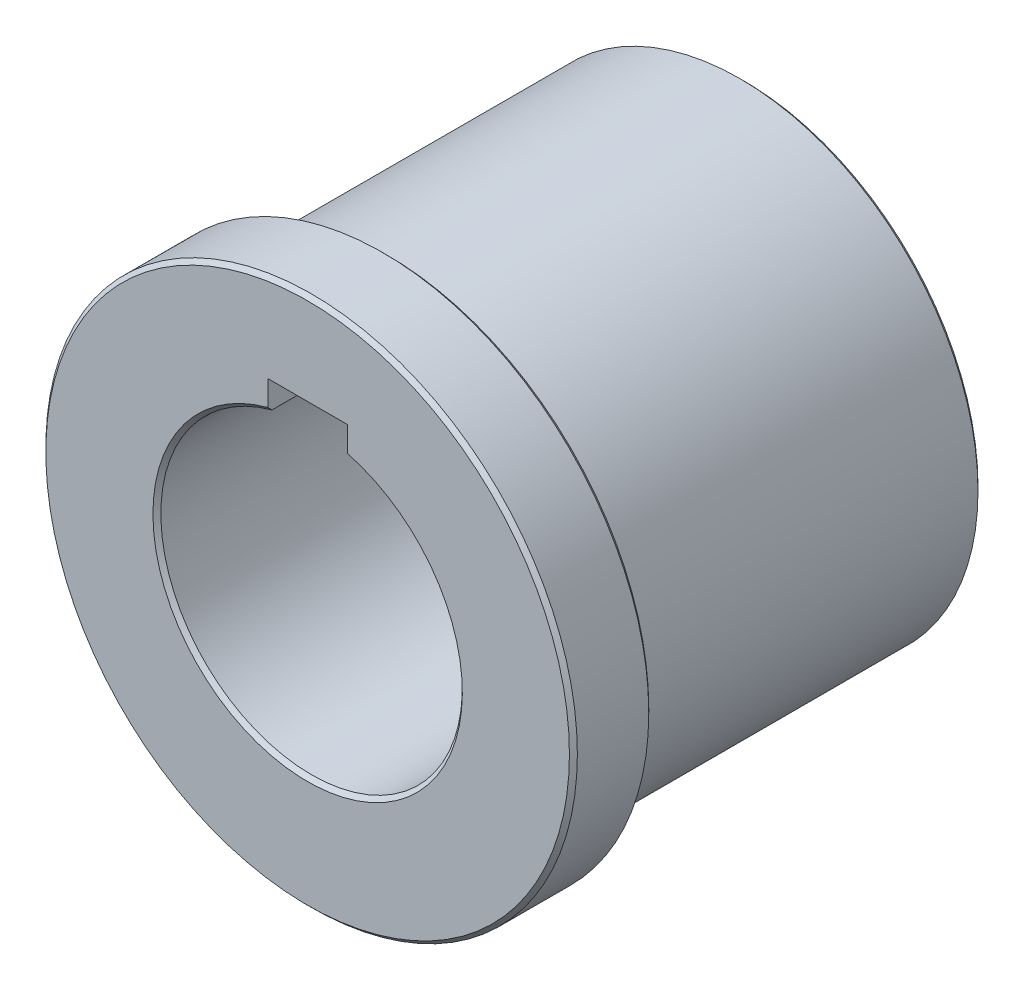
ISO-10303-21;
HEADER;
FILE_DESCRIPTION(('STEP AP214'),'2;1');
FILE_NAME('part.step','',(''),(''),'','','');
FILE_SCHEMA(('AUTOMOTIVE_DESIGN { 1 0 10303 214 1 1 1 1 }'));
ENDSEC;
DATA;
#1=APPLICATION_CONTEXT('core data for automotive mechanical design processes');
#2=APPLICATION_PROTOCOL_DEFINITION('international standard','automotive_design',2000,#1);
#3=PRODUCT_CONTEXT('',#1,'mechanical');
#4=PRODUCT('Part','Part','',(#3));
#5=PRODUCT_RELATED_PRODUCT_CATEGORY('part','',(#4));
#6=PRODUCT_DEFINITION_FORMATION('','',#4);
#7=PRODUCT_DEFINITION_CONTEXT('part definition',#1,'design');
#8=PRODUCT_DEFINITION('design','',#6,#7);
#9=PRODUCT_DEFINITION_SHAPE('','',#8);
#10=(LENGTH_UNIT() NAMED_UNIT(*) SI_UNIT(.MILLI.,.METRE.));
#11=(NAMED_UNIT(*) PLANE_ANGLE_UNIT() SI_UNIT($,.RADIAN.));
#12=(NAMED_UNIT(*) SI_UNIT($,.STERADIAN.) SOLID_ANGLE_UNIT());
#13=UNCERTAINTY_MEASURE_WITH_UNIT(LENGTH_MEASURE(1.E-05),#10,'distance_accuracy_value','');
#14=(GEOMETRIC_REPRESENTATION_CONTEXT(3) GLOBAL_UNCERTAINTY_ASSIGNED_CONTEXT((#13)) GLOBAL_UNIT_ASSIGNED_CONTEXT((#10,
#11,#12)) REPRESENTATION_CONTEXT('',''));
#15=CARTESIAN_POINT('',(0.,0.,0.));
#16=DIRECTION('',(0.,0.,1.));
#17=DIRECTION('',(1.,0.,0.));
#18=AXIS2_PLACEMENT_3D('',#15,#16,#17);
#19=CARTESIAN_POINT('',(0.,0.,45.));
#20=DIRECTION('',(0.,0.,-1.));
#21=DIRECTION('',(-1.,0.,0.));
#22=AXIS2_PLACEMENT_3D('',#19,#20,#21);
#23=CYLINDRICAL_SURFACE('',#22,30.);
#24=CARTESIAN_POINT('',(0.,0.,0.500000000000056));
#25=DIRECTION('',(0.,0.,1.));
#26=DIRECTION('',(1.,0.,0.));
#27=AXIS2_PLACEMENT_3D('',#24,#25,#26);
#28=CIRCLE('',#27,30.);
#29=CARTESIAN_POINT('',(-30.,0.,0.500000000000049));
#30=VERTEX_POINT('',#29);
#31=EDGE_CURVE('E498',#30,#30,#28,.T.);
#32=CARTESIAN_POINT('',(0.,0.,45.));
#33=DIRECTION('',(0.,0.,1.));
#34=DIRECTION('',(1.,0.,0.));
#35=AXIS2_PLACEMENT_3D('',#32,#33,#34);
#36=CIRCLE('',#35,30.);
#37=CARTESIAN_POINT('',(-30.,0.,45.));
#38=VERTEX_POINT('',#37);
#39=EDGE_CURVE('E127',#38,#38,#36,.T.);
#40=CARTESIAN_POINT('',(-30.,0.,0.500000000000049));
#41=CARTESIAN_POINT('',(-30.,0.,0.963541666666716));
#42=CARTESIAN_POINT('',(-30.,0.,1.42708333333338));
#43=CARTESIAN_POINT('',(-30.,0.,2.35416666666671));
#44=CARTESIAN_POINT('',(-30.,0.,2.81770833333338));
#45=CARTESIAN_POINT('',(-30.,0.,3.74479166666671));
#46=CARTESIAN_POINT('',(-30.,0.,4.20833333333338));
#47=CARTESIAN_POINT('',(-30.,0.,5.13541666666671));
#48=CARTESIAN_POINT('',(-30.,0.,5.59895833333337));
#49=CARTESIAN_POINT('',(-30.,0.,6.52604166666671));
#50=CARTESIAN_POINT('',(-30.,0.,6.98958333333337));
#51=CARTESIAN_POINT('',(-30.,0.,7.91666666666671));
#52=CARTESIAN_POINT('',(-30.,0.,8.38020833333337));
#53=CARTESIAN_POINT('',(-30.,0.,9.30729166666671));
#54=CARTESIAN_POINT('',(-30.,0.,9.77083333333337));
#55=CARTESIAN_POINT('',(-30.,0.,10.6979166666667));
#56=CARTESIAN_POINT('',(-30.,0.,11.1614583333334));
#57=CARTESIAN_POINT('',(-30.,0.,12.0885416666667));
#58=CARTESIAN_POINT('',(-30.,0.,12.5520833333334));
#59=CARTESIAN_POINT('',(-30.,0.,13.4791666666667));
#60=CARTESIAN_POINT('',(-30.,0.,13.9427083333334));
#61=CARTESIAN_POINT('',(-30.,0.,14.8697916666667));
#62=CARTESIAN_POINT('',(-30.,0.,15.3333333333334));
#63=CARTESIAN_POINT('',(-30.,0.,16.2604166666667));
#64=CARTESIAN_POINT('',(-30.,0.,16.7239583333334));
#65=CARTESIAN_POINT('',(-30.,0.,17.6510416666667));
#66=CARTESIAN_POINT('',(-30.,0.,18.1145833333334));
#67=CARTESIAN_POINT('',(-30.,0.,19.0416666666667));
#68=CARTESIAN_POINT('',(-30.,0.,19.5052083333334));
#69=CARTESIAN_POINT('',(-30.,0.,20.4322916666667));
#70=CARTESIAN_POINT('',(-30.,0.,20.8958333333334));
#71=CARTESIAN_POINT('',(-30.,0.,21.8229166666667));
#72=CARTESIAN_POINT('',(-30.,0.,22.2864583333334));
#73=CARTESIAN_POINT('',(-30.,0.,23.2135416666667));
#74=CARTESIAN_POINT('',(-30.,0.,23.6770833333334));
#75=CARTESIAN_POINT('',(-30.,0.,24.6041666666667));
#76=CARTESIAN_POINT('',(-30.,0.,25.0677083333333));
#77=CARTESIAN_POINT('',(-30.,0.,25.9947916666667));
#78=CARTESIAN_POINT('',(-30.,0.,26.4583333333333));
#79=CARTESIAN_POINT('',(-30.,0.,27.3854166666667));
#80=CARTESIAN_POINT('',(-30.,0.,27.8489583333333));
#81=CARTESIAN_POINT('',(-30.,0.,28.7760416666667));
#82=CARTESIAN_POINT('',(-30.,0.,29.2395833333333));
#83=CARTESIAN_POINT('',(-30.,0.,30.1666666666667));
#84=CARTESIAN_POINT('',(-30.,0.,30.6302083333333));
#85=CARTESIAN_POINT('',(-30.,0.,31.5572916666667));
#86=CARTESIAN_POINT('',(-30.,0.,32.0208333333333));
#87=CARTESIAN_POINT('',(-30.,0.,32.9479166666667));
#88=CARTESIAN_POINT('',(-30.,0.,33.4114583333333));
#89=CARTESIAN_POINT('',(-30.,0.,34.3385416666667));
#90=CARTESIAN_POINT('',(-30.,0.,34.8020833333333));
#91=CARTESIAN_POINT('',(-30.,0.,35.7291666666667));
#92=CARTESIAN_POINT('',(-30.,0.,36.1927083333333));
#93=CARTESIAN_POINT('',(-30.,0.,37.1197916666667));
#94=CARTESIAN_POINT('',(-30.,0.,37.5833333333333));
#95=CARTESIAN_POINT('',(-30.,0.,38.5104166666667));
#96=CARTESIAN_POINT('',(-30.,0.,38.9739583333333));
#97=CARTESIAN_POINT('',(-30.,0.,39.9010416666667));
#98=CARTESIAN_POINT('',(-30.,0.,40.3645833333333));
#99=CARTESIAN_POINT('',(-30.,0.,41.2916666666667));
#100=CARTESIAN_POINT('',(-30.,0.,41.7552083333333));
#101=CARTESIAN_POINT('',(-30.,0.,42.6822916666667));
#102=CARTESIAN_POINT('',(-30.,0.,43.1458333333333));
#103=CARTESIAN_POINT('',(-30.,0.,44.0729166666667));
#104=CARTESIAN_POINT('',(-30.,0.,44.5364583333333));
#105=CARTESIAN_POINT('',(-30.,0.,45.));
#106=B_SPLINE_CURVE_WITH_KNOTS('',3,(#40,#41,#42,#43,#44,#45,#46,#47,#48,#49,#50,#51,#52,#53,
#54,#55,#56,#57,#58,#59,#60,#61,#62,#63,#64,#65,#66,#67,#68,#69,#70,#71,#72,#73,#74,#75,#76,#77,
#78,#79,#80,#81,#82,#83,#84,#85,#86,#87,#88,#89,#90,#91,#92,#93,#94,#95,#96,#97,#98,#99,#100,
#101,#102,#103,#104,#105),.UNSPECIFIED.,.F.,.F.,(4,2,2,2,2,2,2,2,2,2,2,2,2,2,2,2,2,2,2,2,2,2,2,
2,2,2,2,2,2,2,2,2,4),(0.,1.390625,2.78125,4.17187499999999,5.56249999999999,6.95312499999999,
8.34374999999999,9.73437499999999,11.125,12.515625,13.90625,15.296875,16.6875,18.078125,
19.46875,20.859375,22.25,23.640625,25.03125,26.421875,27.8125,29.203125,30.59375,31.984375,
33.375,34.765625,36.15625,37.546875,38.9375,40.3281249999999,41.7187499999999,43.1093749999999,
44.4999999999999),.UNSPECIFIED.);
#107=EDGE_CURVE('BSEAM37',#30,#38,#106,.T.);
#108=ORIENTED_EDGE('',*,*,#31,.T.);
#109=ORIENTED_EDGE('',*,*,#39,.F.);
#110=ORIENTED_EDGE('',*,*,#107,.T.);
#111=ORIENTED_EDGE('',*,*,#107,.F.);
#112=EDGE_LOOP('',(#108,#110,#109,#111));
#113=FACE_BOUND('',#112,.T.);
#114=ADVANCED_FACE('F37',(#113),#23,.T.);
#115=CARTESIAN_POINT('',(0.,0.,0.));
#116=DIRECTION('',(0.,0.,1.));
#117=DIRECTION('',(1.,0.,0.));
#118=AXIS2_PLACEMENT_3D('',#115,#116,#117);
#119=PLANE('',#118);
#120=CARTESIAN_POINT('',(0.,0.,0.));
#121=DIRECTION('',(0.,0.,1.));
#122=DIRECTION('',(1.,0.,0.));
#123=AXIS2_PLACEMENT_3D('',#120,#121,#122);
#124=CIRCLE('',#123,29.4999999999999);
#125=CARTESIAN_POINT('',(29.4999999999999,0.,0.));
#126=VERTEX_POINT('',#125);
#127=EDGE_CURVE('E205',#126,#126,#124,.F.);
#128=ORIENTED_EDGE('',*,*,#127,.T.);
#129=EDGE_LOOP('',(#128));
#130=FACE_BOUND('',#129,.T.);
#131=CARTESIAN_POINT('',(-25.,0.,0.));
#132=DIRECTION('',(0.,0.,1.));
#133=DIRECTION('',(1.,0.,0.));
#134=AXIS2_PLACEMENT_3D('',#131,#132,#133);
#135=CIRCLE('',#134,2.99999999999999);
#136=CARTESIAN_POINT('',(-22.,0.,0.));
#137=VERTEX_POINT('',#136);
#138=EDGE_CURVE('E294',#137,#137,#135,.T.);
#139=ORIENTED_EDGE('',*,*,#138,.T.);
#140=EDGE_LOOP('',(#139));
#141=FACE_BOUND('',#140,.T.);
#142=CARTESIAN_POINT('',(-12.5,-21.650635094611,0.));
#143=DIRECTION('',(0.,0.,1.));
#144=DIRECTION('',(1.,0.,0.));
#145=AXIS2_PLACEMENT_3D('',#142,#143,#144);
#146=CIRCLE('',#145,3.);
#147=CARTESIAN_POINT('',(-9.49999999999996,-21.650635094611,0.));
#148=VERTEX_POINT('',#147);
#149=EDGE_CURVE('E288',#148,#148,#146,.T.);
#150=ORIENTED_EDGE('',*,*,#149,.T.);
#151=EDGE_LOOP('',(#150));
#152=FACE_BOUND('',#151,.T.);
#153=CARTESIAN_POINT('',(12.5,-21.6506350946109,0.));
#154=DIRECTION('',(0.,0.,1.));
#155=DIRECTION('',(1.,0.,0.));
#156=AXIS2_PLACEMENT_3D('',#153,#154,#155);
#157=CIRCLE('',#156,3.);
#158=CARTESIAN_POINT('',(15.5,-21.6506350946109,0.));
#159=VERTEX_POINT('',#158);
#160=EDGE_CURVE('E282',#159,#159,#157,.T.);
#161=ORIENTED_EDGE('',*,*,#160,.T.);
#162=EDGE_LOOP('',(#161));
#163=FACE_BOUND('',#162,.T.);
#164=CARTESIAN_POINT('',(25.,0.,0.));
#165=DIRECTION('',(0.,0.,1.));
#166=DIRECTION('',(1.,0.,0.));
#167=AXIS2_PLACEMENT_3D('',#164,#165,#166);
#168=CIRCLE('',#167,2.99999999999999);
#169=CARTESIAN_POINT('',(28.,0.,0.));
#170=VERTEX_POINT('',#169);
#171=EDGE_CURVE('E276',#170,#170,#168,.T.);
#172=ORIENTED_EDGE('',*,*,#171,.T.);
#173=EDGE_LOOP('',(#172));
#174=FACE_BOUND('',#173,.T.);
#175=CARTESIAN_POINT('',(12.5,21.650635094611,0.));
#176=DIRECTION('',(0.,0.,1.));
#177=DIRECTION('',(1.,0.,0.));
#178=AXIS2_PLACEMENT_3D('',#175,#176,#177);
#179=CIRCLE('',#178,3.);
#180=CARTESIAN_POINT('',(15.5,21.650635094611,0.));
#181=VERTEX_POINT('',#180);
#182=EDGE_CURVE('E267',#181,#181,#179,.T.);
#183=ORIENTED_EDGE('',*,*,#182,.T.);
#184=EDGE_LOOP('',(#183));
#185=FACE_BOUND('',#184,.T.);
#186=CARTESIAN_POINT('',(-12.5,21.6506350946109,0.));
#187=DIRECTION('',(0.,0.,1.));
#188=DIRECTION('',(1.,0.,0.));
#189=AXIS2_PLACEMENT_3D('',#186,#187,#188);
#190=CIRCLE('',#189,3.);
#191=CARTESIAN_POINT('',(-9.50000000000003,21.6506350946109,0.));
#192=VERTEX_POINT('',#191);
#193=EDGE_CURVE('E266',#192,#192,#190,.T.);
#194=ORIENTED_EDGE('',*,*,#193,.T.);
#195=EDGE_LOOP('',(#194));
#196=FACE_BOUND('',#195,.T.);
#197=DIRECTION('',(0.,-1.,0.));
#198=VECTOR('',#197,1.);
#199=CARTESIAN_POINT('',(-5.,18.3303027798234,0.));
#200=LINE('',#199,#198);
#201=CARTESIAN_POINT('',(-5.,22.,0.));
#202=VERTEX_POINT('',#201);
#203=CARTESIAN_POINT('',(-5.,18.8480768249708,0.));
#204=VERTEX_POINT('',#203);
#205=EDGE_CURVE('E106',#202,#204,#200,.T.);
#206=ORIENTED_EDGE('',*,*,#205,.T.);
#207=CARTESIAN_POINT('',(0.,0.,0.));
#208=DIRECTION('',(0.,0.,1.));
#209=DIRECTION('',(1.,0.,0.));
#210=AXIS2_PLACEMENT_3D('',#207,#208,#209);
#211=CIRCLE('',#210,19.5);
#212=CARTESIAN_POINT('',(5.,18.8480768249708,0.));
#213=VERTEX_POINT('',#212);
#214=EDGE_CURVE('E497',#204,#213,#211,.T.);
#215=ORIENTED_EDGE('',*,*,#214,.T.);
#216=DIRECTION('',(0.,1.,0.));
#217=VECTOR('',#216,1.);
#218=CARTESIAN_POINT('',(5.,18.3303027798234,0.));
#219=LINE('',#218,#217);
#220=CARTESIAN_POINT('',(5.,22.,0.));
#221=VERTEX_POINT('',#220);
#222=EDGE_CURVE('E115',#213,#221,#219,.T.);
#223=ORIENTED_EDGE('',*,*,#222,.T.);
#224=DIRECTION('',(-1.,0.,0.));
#225=VECTOR('',#224,1.);
#226=CARTESIAN_POINT('',(-5.,22.,0.));
#227=LINE('',#226,#225);
#228=EDGE_CURVE('E99',#221,#202,#227,.T.);
#229=ORIENTED_EDGE('',*,*,#228,.T.);
#230=EDGE_LOOP('',(#206,#215,#223,#229));
#231=FACE_BOUND('',#230,.T.);
#232=ADVANCED_FACE('F113',(#130,#141,#152,#163,#174,#185,#196,#231),#119,.F.);
#233=CARTESIAN_POINT('',(0.,0.,55.));
#234=DIRECTION('',(0.,0.,-1.));
#235=DIRECTION('',(-1.,0.,0.));
#236=AXIS2_PLACEMENT_3D('',#233,#234,#235);
#237=CYLINDRICAL_SURFACE('',#236,33.5);
#238=CARTESIAN_POINT('',(0.,0.,45.5));
#239=DIRECTION('',(0.,0.,1.));
#240=DIRECTION('',(1.,0.,0.));
#241=AXIS2_PLACEMENT_3D('',#238,#239,#240);
#242=CIRCLE('',#241,33.5);
#243=CARTESIAN_POINT('',(33.5,0.,45.5));
#244=VERTEX_POINT('',#243);
#245=EDGE_CURVE('E46',#244,#244,#242,.T.);
#246=ORIENTED_EDGE('',*,*,#245,.T.);
#247=EDGE_LOOP('',(#246));
#248=FACE_BOUND('',#247,.T.);
#249=CARTESIAN_POINT('',(0.,0.,54.5));
#250=DIRECTION('',(0.,0.,1.));
#251=DIRECTION('',(1.,0.,0.));
#252=AXIS2_PLACEMENT_3D('',#249,#250,#251);
#253=CIRCLE('',#252,33.5);
#254=CARTESIAN_POINT('',(33.5,0.,54.5));
#255=VERTEX_POINT('',#254);
#256=EDGE_CURVE('E489',#255,#255,#253,.F.);
#257=ORIENTED_EDGE('',*,*,#256,.T.);
#258=EDGE_LOOP('',(#257));
#259=FACE_BOUND('',#258,.T.);
#260=ADVANCED_FACE('F175',(#248,#259),#237,.T.);
#261=CARTESIAN_POINT('',(0.,0.,55.));
#262=DIRECTION('',(0.,0.,1.));
#263=DIRECTION('',(1.,0.,0.));
#264=AXIS2_PLACEMENT_3D('',#261,#262,#263);
#265=PLANE('',#264);
#266=CARTESIAN_POINT('',(0.,0.,55.));
#267=DIRECTION('',(0.,0.,1.));
#268=DIRECTION('',(1.,0.,0.));
#269=AXIS2_PLACEMENT_3D('',#266,#267,#268);
#270=CIRCLE('',#269,33.);
#271=CARTESIAN_POINT('',(33.,0.,55.));
#272=VERTEX_POINT('',#271);
#273=EDGE_CURVE('E492',#272,#272,#270,.T.);
#274=ORIENTED_EDGE('',*,*,#273,.T.);
#275=EDGE_LOOP('',(#274));
#276=FACE_BOUND('',#275,.T.);
#277=DIRECTION('',(0.,1.,0.));
#278=VECTOR('',#277,1.);
#279=CARTESIAN_POINT('',(5.,18.3303027798234,55.));
#280=LINE('',#279,#278);
#281=CARTESIAN_POINT('',(5.,18.8480768249708,55.));
#282=VERTEX_POINT('',#281);
#283=CARTESIAN_POINT('',(5.,22.,55.));
#284=VERTEX_POINT('',#283);
#285=EDGE_CURVE('E121',#282,#284,#280,.T.);
#286=ORIENTED_EDGE('',*,*,#285,.F.);
#287=CARTESIAN_POINT('',(0.,0.,55.));
#288=DIRECTION('',(0.,0.,1.));
#289=DIRECTION('',(1.,0.,0.));
#290=AXIS2_PLACEMENT_3D('',#287,#288,#289);
#291=CIRCLE('',#290,19.5);
#292=CARTESIAN_POINT('',(-5.,18.8480768249708,55.));
#293=VERTEX_POINT('',#292);
#294=EDGE_CURVE('E61',#282,#293,#291,.F.);
#295=ORIENTED_EDGE('',*,*,#294,.T.);
#296=DIRECTION('',(0.,-1.,0.));
#297=VECTOR('',#296,1.);
#298=CARTESIAN_POINT('',(-5.,18.3303027798234,55.));
#299=LINE('',#298,#297);
#300=CARTESIAN_POINT('',(-5.,22.,55.));
#301=VERTEX_POINT('',#300);
#302=EDGE_CURVE('E117',#301,#293,#299,.T.);
#303=ORIENTED_EDGE('',*,*,#302,.F.);
#304=DIRECTION('',(-1.,0.,0.));
#305=VECTOR('',#304,1.);
#306=CARTESIAN_POINT('',(-5.,22.,55.));
#307=LINE('',#306,#305);
#308=EDGE_CURVE('E102',#284,#301,#307,.T.);
#309=ORIENTED_EDGE('',*,*,#308,.F.);
#310=EDGE_LOOP('',(#286,#295,#303,#309));
#311=FACE_BOUND('',#310,.T.);
#312=ADVANCED_FACE('F172',(#276,#311),#265,.T.);
#313=CARTESIAN_POINT('',(0.,0.,45.));
#314=DIRECTION('',(0.,0.,1.));
#315=DIRECTION('',(1.,0.,0.));
#316=AXIS2_PLACEMENT_3D('',#313,#314,#315);
#317=PLANE('',#316);
#318=CARTESIAN_POINT('',(0.,0.,45.));
#319=DIRECTION('',(0.,0.,1.));
#320=DIRECTION('',(1.,0.,0.));
#321=AXIS2_PLACEMENT_3D('',#318,#319,#320);
#322=CIRCLE('',#321,33.);
#323=CARTESIAN_POINT('',(33.,0.,45.));
#324=VERTEX_POINT('',#323);
#325=EDGE_CURVE('E11',#324,#324,#322,.F.);
#326=ORIENTED_EDGE('',*,*,#325,.T.);
#327=EDGE_LOOP('',(#326));
#328=FACE_BOUND('',#327,.T.);
#329=ORIENTED_EDGE('',*,*,#39,.T.);
#330=EDGE_LOOP('',(#329));
#331=FACE_BOUND('',#330,.T.);
#332=ADVANCED_FACE('F170',(#328,#331),#317,.F.);
#333=CARTESIAN_POINT('',(0.,0.,0.));
#334=DIRECTION('',(0.,0.,1.));
#335=DIRECTION('',(1.,0.,0.));
#336=AXIS2_PLACEMENT_3D('',#333,#334,#335);
#337=CYLINDRICAL_SURFACE('',#336,19.);
#338=DIRECTION('',(0.,0.,1.));
#339=VECTOR('',#338,1.);
#340=CARTESIAN_POINT('',(-5.,18.3303027798234,0.));
#341=LINE('',#340,#339);
#342=CARTESIAN_POINT('',(-5.,18.3303027798234,0.500000000000014));
#343=VERTEX_POINT('',#342);
#344=CARTESIAN_POINT('',(-5.,18.3303027798234,54.5));
#345=VERTEX_POINT('',#344);
#346=EDGE_CURVE('E103',#343,#345,#341,.T.);
#347=ORIENTED_EDGE('',*,*,#346,.T.);
#348=CARTESIAN_POINT('',(0.,0.,54.5));
#349=DIRECTION('',(0.,0.,1.));
#350=DIRECTION('',(1.,0.,0.));
#351=AXIS2_PLACEMENT_3D('',#348,#349,#350);
#352=CIRCLE('',#351,19.);
#353=CARTESIAN_POINT('',(5.,18.3303027798234,54.5));
#354=VERTEX_POINT('',#353);
#355=EDGE_CURVE('E136',#345,#354,#352,.T.);
#356=ORIENTED_EDGE('',*,*,#355,.T.);
#357=DIRECTION('',(0.,0.,1.));
#358=VECTOR('',#357,1.);
#359=CARTESIAN_POINT('',(5.,18.3303027798234,0.));
#360=LINE('',#359,#358);
#361=CARTESIAN_POINT('',(5.,18.3303027798234,0.500000000000014));
#362=VERTEX_POINT('',#361);
#363=EDGE_CURVE('E111',#362,#354,#360,.T.);
#364=ORIENTED_EDGE('',*,*,#363,.F.);
#365=CARTESIAN_POINT('',(0.,0.,0.500000000000014));
#366=DIRECTION('',(0.,0.,1.));
#367=DIRECTION('',(1.,0.,0.));
#368=AXIS2_PLACEMENT_3D('',#365,#366,#367);
#369=CIRCLE('',#368,19.);
#370=EDGE_CURVE('E134',#362,#343,#369,.F.);
#371=ORIENTED_EDGE('',*,*,#370,.T.);
#372=EDGE_LOOP('',(#347,#356,#364,#371));
#373=FACE_BOUND('',#372,.T.);
#374=ADVANCED_FACE('F166',(#373),#337,.F.);
#375=CARTESIAN_POINT('',(-5.,18.3303027798234,0.));
#376=DIRECTION('',(-1.,0.,0.));
#377=DIRECTION('',(0.,0.,1.));
#378=AXIS2_PLACEMENT_3D('',#375,#376,#377);
#379=PLANE('',#378);
#380=ORIENTED_EDGE('',*,*,#302,.T.);
#381=CARTESIAN_POINT('',(-5.,18.8480768249708,55.));
#382=CARTESIAN_POINT('',(-5.,18.7618202827309,54.9166261437728));
#383=CARTESIAN_POINT('',(-5.,18.6755441745463,54.8332725490223));
#384=CARTESIAN_POINT('',(-5.,18.5029528261638,54.6666058823556));
#385=CARTESIAN_POINT('',(-5.,18.416637585966,54.5832928104394));
#386=CARTESIAN_POINT('',(-5.,18.3303027798234,54.5));
#387=B_SPLINE_CURVE_WITH_KNOTS('',3,(#381,#382,#383,#384,#385,#386),.UNSPECIFIED.,.F.,.F.,(4,2,
4),(0.,0.35989234141864,0.719784683352608),.UNSPECIFIED.);
#388=EDGE_CURVE('E198',#293,#345,#387,.T.);
#389=ORIENTED_EDGE('',*,*,#388,.T.);
#390=ORIENTED_EDGE('',*,*,#346,.F.);
#391=CARTESIAN_POINT('',(-5.,18.3303027798234,0.500000000000014));
#392=CARTESIAN_POINT('',(-5.,18.416637585966,0.416707189560611));
#393=CARTESIAN_POINT('',(-5.,18.5029528261638,0.333394117644396));
#394=CARTESIAN_POINT('',(-5.,18.6755441745463,0.166727450977667));
#395=CARTESIAN_POINT('',(-5.,18.7618202827309,0.0833738562272108));
#396=CARTESIAN_POINT('',(-5.,18.8480768249708,0.));
#397=B_SPLINE_CURVE_WITH_KNOTS('',3,(#391,#392,#393,#394,#395,#396),.UNSPECIFIED.,.F.,.F.,(4,2,
4),(0.,0.359892341933974,0.719784683352627),.UNSPECIFIED.);
#398=EDGE_CURVE('E53',#343,#204,#397,.T.);
#399=ORIENTED_EDGE('',*,*,#398,.T.);
#400=ORIENTED_EDGE('',*,*,#205,.F.);
#401=DIRECTION('',(0.,0.,1.));
#402=VECTOR('',#401,1.);
#403=CARTESIAN_POINT('',(-5.,22.,0.));
#404=LINE('',#403,#402);
#405=EDGE_CURVE('E95',#202,#301,#404,.T.);
#406=ORIENTED_EDGE('',*,*,#405,.T.);
#407=EDGE_LOOP('',(#380,#389,#390,#399,#400,#406));
#408=FACE_BOUND('',#407,.T.);
#409=ADVANCED_FACE('F107',(#408),#379,.F.);
#410=CARTESIAN_POINT('',(-5.,22.,0.));
#411=DIRECTION('',(0.,1.,0.));
#412=DIRECTION('',(0.,0.,1.));
#413=AXIS2_PLACEMENT_3D('',#410,#411,#412);
#414=PLANE('',#413);
#415=ORIENTED_EDGE('',*,*,#308,.T.);
#416=ORIENTED_EDGE('',*,*,#405,.F.);
#417=ORIENTED_EDGE('',*,*,#228,.F.);
#418=DIRECTION('',(0.,0.,1.));
#419=VECTOR('',#418,1.);
#420=CARTESIAN_POINT('',(5.,22.,0.));
#421=LINE('',#420,#419);
#422=EDGE_CURVE('E104',#221,#284,#421,.T.);
#423=ORIENTED_EDGE('',*,*,#422,.T.);
#424=EDGE_LOOP('',(#415,#416,#417,#423));
#425=FACE_BOUND('',#424,.T.);
#426=ADVANCED_FACE('F96',(#425),#414,.F.);
#427=CARTESIAN_POINT('',(5.,18.3303027798234,0.));
#428=DIRECTION('',(1.,0.,0.));
#429=DIRECTION('',(0.,0.,-1.));
#430=AXIS2_PLACEMENT_3D('',#427,#428,#429);
#431=PLANE('',#430);
#432=ORIENTED_EDGE('',*,*,#363,.T.);
#433=CARTESIAN_POINT('',(5.,18.3303027798234,54.5));
#434=CARTESIAN_POINT('',(5.,18.416637585966,54.5832928104394));
#435=CARTESIAN_POINT('',(5.,18.5029528261638,54.6666058823556));
#436=CARTESIAN_POINT('',(5.,18.6755441745462,54.8332725490223));
#437=CARTESIAN_POINT('',(5.,18.7618202827309,54.9166261437728));
#438=CARTESIAN_POINT('',(5.,18.8480768249708,55.));
#439=B_SPLINE_CURVE_WITH_KNOTS('',3,(#433,#434,#435,#436,#437,#438),.UNSPECIFIED.,.F.,.F.,(4,2,
4),(0.,0.359892341933966,0.71978468335261),.UNSPECIFIED.);
#440=EDGE_CURVE('E147',#354,#282,#439,.T.);
#441=ORIENTED_EDGE('',*,*,#440,.T.);
#442=ORIENTED_EDGE('',*,*,#285,.T.);
#443=ORIENTED_EDGE('',*,*,#422,.F.);
#444=ORIENTED_EDGE('',*,*,#222,.F.);
#445=CARTESIAN_POINT('',(5.,18.8480768249708,0.));
#446=CARTESIAN_POINT('',(5.,18.7618202827309,0.0833738562272099));
#447=CARTESIAN_POINT('',(5.,18.6755441745462,0.166727450977667));
#448=CARTESIAN_POINT('',(5.,18.5029528261638,0.333394117644397));
#449=CARTESIAN_POINT('',(5.,18.416637585966,0.416707189560613));
#450=CARTESIAN_POINT('',(5.,18.3303027798234,0.500000000000017));
#451=B_SPLINE_CURVE_WITH_KNOTS('',3,(#445,#446,#447,#448,#449,#450),.UNSPECIFIED.,.F.,.F.,(4,2,
4),(0.,0.359892341418656,0.719784683352631),.UNSPECIFIED.);
#452=EDGE_CURVE('E139',#213,#362,#451,.T.);
#453=ORIENTED_EDGE('',*,*,#452,.T.);
#454=EDGE_LOOP('',(#432,#441,#442,#443,#444,#453));
#455=FACE_BOUND('',#454,.T.);
#456=ADVANCED_FACE('F158',(#455),#431,.F.);
#457=CARTESIAN_POINT('',(-12.5,21.6506350946109,18.));
#458=DIRECTION('',(0.,0.,-1.));
#459=DIRECTION('',(-1.,0.,0.));
#460=AXIS2_PLACEMENT_3D('',#457,#458,#459);
#461=CYLINDRICAL_SURFACE('',#460,3.);
#462=CARTESIAN_POINT('',(-12.5,21.6506350946109,18.));
#463=DIRECTION('',(0.,0.,1.));
#464=DIRECTION('',(1.,0.,0.));
#465=AXIS2_PLACEMENT_3D('',#462,#463,#464);
#466=CIRCLE('',#465,3.);
#467=CARTESIAN_POINT('',(-9.50000000000003,21.6506350946109,18.));
#468=VERTEX_POINT('',#467);
#469=EDGE_CURVE('E123',#468,#468,#466,.T.);
#470=ORIENTED_EDGE('',*,*,#469,.T.);
#471=EDGE_LOOP('',(#470));
#472=FACE_BOUND('',#471,.T.);
#473=ORIENTED_EDGE('',*,*,#193,.F.);
#474=EDGE_LOOP('',(#473));
#475=FACE_BOUND('',#474,.T.);
#476=ADVANCED_FACE('F163',(#472,#475),#461,.F.);
#477=CARTESIAN_POINT('',(-12.5,21.6506350946109,18.));
#478=DIRECTION('',(0.,0.,1.));
#479=DIRECTION('',(1.,0.,0.));
#480=AXIS2_PLACEMENT_3D('',#477,#478,#479);
#481=PLANE('',#480);
#482=ORIENTED_EDGE('',*,*,#469,.F.);
#483=EDGE_LOOP('',(#482));
#484=FACE_BOUND('',#483,.T.);
#485=ADVANCED_FACE('F218',(#484),#481,.F.);
#486=CARTESIAN_POINT('',(12.5,21.650635094611,18.));
#487=DIRECTION('',(0.,0.,-1.));
#488=DIRECTION('',(-1.,0.,0.));
#489=AXIS2_PLACEMENT_3D('',#486,#487,#488);
#490=CYLINDRICAL_SURFACE('',#489,3.);
#491=CARTESIAN_POINT('',(12.5,21.650635094611,18.));
#492=DIRECTION('',(0.,0.,1.));
#493=DIRECTION('',(1.,0.,0.));
#494=AXIS2_PLACEMENT_3D('',#491,#492,#493);
#495=CIRCLE('',#494,3.);
#496=CARTESIAN_POINT('',(15.5,21.650635094611,18.));
#497=VERTEX_POINT('',#496);
#498=EDGE_CURVE('E265',#497,#497,#495,.T.);
#499=ORIENTED_EDGE('',*,*,#498,.T.);
#500=EDGE_LOOP('',(#499));
#501=FACE_BOUND('',#500,.T.);
#502=ORIENTED_EDGE('',*,*,#182,.F.);
#503=EDGE_LOOP('',(#502));
#504=FACE_BOUND('',#503,.T.);
#505=ADVANCED_FACE('F222',(#501,#504),#490,.F.);
#506=CARTESIAN_POINT('',(12.5,21.650635094611,18.));
#507=DIRECTION('',(0.,0.,1.));
#508=DIRECTION('',(1.,0.,0.));
#509=AXIS2_PLACEMENT_3D('',#506,#507,#508);
#510=PLANE('',#509);
#511=ORIENTED_EDGE('',*,*,#498,.F.);
#512=EDGE_LOOP('',(#511));
#513=FACE_BOUND('',#512,.T.);
#514=ADVANCED_FACE('F251',(#513),#510,.F.);
#515=CARTESIAN_POINT('',(25.,0.,18.));
#516=DIRECTION('',(0.,0.,-1.));
#517=DIRECTION('',(-1.,0.,0.));
#518=AXIS2_PLACEMENT_3D('',#515,#516,#517);
#519=CYLINDRICAL_SURFACE('',#518,2.99999999999999);
#520=CARTESIAN_POINT('',(25.,0.,18.));
#521=DIRECTION('',(0.,0.,1.));
#522=DIRECTION('',(1.,0.,0.));
#523=AXIS2_PLACEMENT_3D('',#520,#521,#522);
#524=CIRCLE('',#523,2.99999999999999);
#525=CARTESIAN_POINT('',(28.,0.,18.));
#526=VERTEX_POINT('',#525);
#527=EDGE_CURVE('E271',#526,#526,#524,.T.);
#528=ORIENTED_EDGE('',*,*,#527,.T.);
#529=EDGE_LOOP('',(#528));
#530=FACE_BOUND('',#529,.T.);
#531=ORIENTED_EDGE('',*,*,#171,.F.);
#532=EDGE_LOOP('',(#531));
#533=FACE_BOUND('',#532,.T.);
#534=ADVANCED_FACE('F248',(#530,#533),#519,.F.);
#535=CARTESIAN_POINT('',(25.,0.,18.));
#536=DIRECTION('',(0.,0.,1.));
#537=DIRECTION('',(1.,0.,0.));
#538=AXIS2_PLACEMENT_3D('',#535,#536,#537);
#539=PLANE('',#538);
#540=ORIENTED_EDGE('',*,*,#527,.F.);
#541=EDGE_LOOP('',(#540));
#542=FACE_BOUND('',#541,.T.);
#543=ADVANCED_FACE('F243',(#542),#539,.F.);
#544=CARTESIAN_POINT('',(12.5,-21.6506350946109,18.));
#545=DIRECTION('',(0.,0.,-1.));
#546=DIRECTION('',(-1.,0.,0.));
#547=AXIS2_PLACEMENT_3D('',#544,#545,#546);
#548=CYLINDRICAL_SURFACE('',#547,3.);
#549=CARTESIAN_POINT('',(12.5,-21.6506350946109,18.));
#550=DIRECTION('',(0.,0.,1.));
#551=DIRECTION('',(1.,0.,0.));
#552=AXIS2_PLACEMENT_3D('',#549,#550,#551);
#553=CIRCLE('',#552,3.);
#554=CARTESIAN_POINT('',(15.5,-21.6506350946109,18.));
#555=VERTEX_POINT('',#554);
#556=EDGE_CURVE('E279',#555,#555,#553,.T.);
#557=ORIENTED_EDGE('',*,*,#556,.T.);
#558=EDGE_LOOP('',(#557));
#559=FACE_BOUND('',#558,.T.);
#560=ORIENTED_EDGE('',*,*,#160,.F.);
#561=EDGE_LOOP('',(#560));
#562=FACE_BOUND('',#561,.T.);
#563=ADVANCED_FACE('F240',(#559,#562),#548,.F.);
#564=CARTESIAN_POINT('',(12.5,-21.6506350946109,18.));
#565=DIRECTION('',(0.,0.,1.));
#566=DIRECTION('',(1.,0.,0.));
#567=AXIS2_PLACEMENT_3D('',#564,#565,#566);
#568=PLANE('',#567);
#569=ORIENTED_EDGE('',*,*,#556,.F.);
#570=EDGE_LOOP('',(#569));
#571=FACE_BOUND('',#570,.T.);
#572=ADVANCED_FACE('F235',(#571),#568,.F.);
#573=CARTESIAN_POINT('',(-12.5,-21.650635094611,18.));
#574=DIRECTION('',(0.,0.,-1.));
#575=DIRECTION('',(-1.,0.,0.));
#576=AXIS2_PLACEMENT_3D('',#573,#574,#575);
#577=CYLINDRICAL_SURFACE('',#576,3.);
#578=CARTESIAN_POINT('',(-12.5,-21.650635094611,18.));
#579=DIRECTION('',(0.,0.,1.));
#580=DIRECTION('',(1.,0.,0.));
#581=AXIS2_PLACEMENT_3D('',#578,#579,#580);
#582=CIRCLE('',#581,3.);
#583=CARTESIAN_POINT('',(-9.49999999999996,-21.650635094611,18.));
#584=VERTEX_POINT('',#583);
#585=EDGE_CURVE('E285',#584,#584,#582,.T.);
#586=ORIENTED_EDGE('',*,*,#585,.T.);
#587=EDGE_LOOP('',(#586));
#588=FACE_BOUND('',#587,.T.);
#589=ORIENTED_EDGE('',*,*,#149,.F.);
#590=EDGE_LOOP('',(#589));
#591=FACE_BOUND('',#590,.T.);
#592=ADVANCED_FACE('F232',(#588,#591),#577,.F.);
#593=CARTESIAN_POINT('',(-12.5,-21.650635094611,18.));
#594=DIRECTION('',(0.,0.,1.));
#595=DIRECTION('',(1.,0.,0.));
#596=AXIS2_PLACEMENT_3D('',#593,#594,#595);
#597=PLANE('',#596);
#598=ORIENTED_EDGE('',*,*,#585,.F.);
#599=EDGE_LOOP('',(#598));
#600=FACE_BOUND('',#599,.T.);
#601=ADVANCED_FACE('F227',(#600),#597,.F.);
#602=CARTESIAN_POINT('',(-25.,0.,18.));
#603=DIRECTION('',(0.,0.,-1.));
#604=DIRECTION('',(-1.,0.,0.));
#605=AXIS2_PLACEMENT_3D('',#602,#603,#604);
#606=CYLINDRICAL_SURFACE('',#605,2.99999999999999);
#607=CARTESIAN_POINT('',(-25.,0.,18.));
#608=DIRECTION('',(0.,0.,1.));
#609=DIRECTION('',(1.,0.,0.));
#610=AXIS2_PLACEMENT_3D('',#607,#608,#609);
#611=CIRCLE('',#610,2.99999999999999);
#612=CARTESIAN_POINT('',(-22.,0.,18.));
#613=VERTEX_POINT('',#612);
#614=EDGE_CURVE('E291',#613,#613,#611,.T.);
#615=ORIENTED_EDGE('',*,*,#614,.T.);
#616=EDGE_LOOP('',(#615));
#617=FACE_BOUND('',#616,.T.);
#618=ORIENTED_EDGE('',*,*,#138,.F.);
#619=EDGE_LOOP('',(#618));
#620=FACE_BOUND('',#619,.T.);
#621=ADVANCED_FACE('F224',(#617,#620),#606,.F.);
#622=CARTESIAN_POINT('',(-25.,0.,18.));
#623=DIRECTION('',(0.,0.,1.));
#624=DIRECTION('',(1.,0.,0.));
#625=AXIS2_PLACEMENT_3D('',#622,#623,#624);
#626=PLANE('',#625);
#627=ORIENTED_EDGE('',*,*,#614,.F.);
#628=EDGE_LOOP('',(#627));
#629=FACE_BOUND('',#628,.T.);
#630=ADVANCED_FACE('F194',(#629),#626,.F.);
#631=CARTESIAN_POINT('',(0.,0.,54.5));
#632=DIRECTION('',(0.,0.,1.));
#633=DIRECTION('',(1.,0.,0.));
#634=AXIS2_PLACEMENT_3D('',#631,#632,#633);
#635=CONICAL_SURFACE('',#634,19.,0.785398163397455);
#636=ORIENTED_EDGE('',*,*,#388,.F.);
#637=ORIENTED_EDGE('',*,*,#294,.F.);
#638=ORIENTED_EDGE('',*,*,#440,.F.);
#639=ORIENTED_EDGE('',*,*,#355,.F.);
#640=EDGE_LOOP('',(#636,#637,#638,#639));
#641=FACE_BOUND('',#640,.T.);
#642=ADVANCED_FACE('F189',(#641),#635,.F.);
#643=CARTESIAN_POINT('',(0.,0.,0.));
#644=DIRECTION('',(0.,0.,-1.));
#645=DIRECTION('',(-1.,0.,0.));
#646=AXIS2_PLACEMENT_3D('',#643,#644,#645);
#647=CONICAL_SURFACE('',#646,19.5,0.785398163397428);
#648=ORIENTED_EDGE('',*,*,#398,.F.);
#649=ORIENTED_EDGE('',*,*,#370,.F.);
#650=ORIENTED_EDGE('',*,*,#452,.F.);
#651=ORIENTED_EDGE('',*,*,#214,.F.);
#652=EDGE_LOOP('',(#648,#649,#650,#651));
#653=FACE_BOUND('',#652,.T.);
#654=ADVANCED_FACE('F155',(#653),#647,.F.);
#655=CARTESIAN_POINT('',(0.,0.,0.500000000000056));
#656=DIRECTION('',(0.,0.,1.));
#657=DIRECTION('',(1.,0.,0.));
#658=AXIS2_PLACEMENT_3D('',#655,#656,#657);
#659=CONICAL_SURFACE('',#658,30.,0.785398163397459);
#660=ORIENTED_EDGE('',*,*,#127,.F.);
#661=EDGE_LOOP('',(#660));
#662=FACE_BOUND('',#661,.T.);
#663=ORIENTED_EDGE('',*,*,#31,.F.);
#664=EDGE_LOOP('',(#663));
#665=FACE_BOUND('',#664,.T.);
#666=ADVANCED_FACE('F367',(#662,#665),#659,.T.);
#667=CARTESIAN_POINT('',(0.,0.,45.5));
#668=DIRECTION('',(0.,0.,1.));
#669=DIRECTION('',(1.,0.,0.));
#670=AXIS2_PLACEMENT_3D('',#667,#668,#669);
#671=CONICAL_SURFACE('',#670,33.5,0.785398163397441);
#672=ORIENTED_EDGE('',*,*,#325,.F.);
#673=EDGE_LOOP('',(#672));
#674=FACE_BOUND('',#673,.T.);
#675=ORIENTED_EDGE('',*,*,#245,.F.);
#676=EDGE_LOOP('',(#675));
#677=FACE_BOUND('',#676,.T.);
#678=ADVANCED_FACE('F374',(#674,#677),#671,.T.);
#679=CARTESIAN_POINT('',(0.,0.,55.));
#680=DIRECTION('',(0.,0.,-1.));
#681=DIRECTION('',(-1.,0.,0.));
#682=AXIS2_PLACEMENT_3D('',#679,#680,#681);
#683=CONICAL_SURFACE('',#682,33.,0.785398163397448);
#684=ORIENTED_EDGE('',*,*,#256,.F.);
#685=EDGE_LOOP('',(#684));
#686=FACE_BOUND('',#685,.T.);
#687=ORIENTED_EDGE('',*,*,#273,.F.);
#688=EDGE_LOOP('',(#687));
#689=FACE_BOUND('',#688,.T.);
#690=ADVANCED_FACE('F40',(#686,#689),#683,.T.);
#691=CLOSED_SHELL('',(#114,#232,#260,#312,#332,#374,#409,#426,#456,#476,#485,#505,#514,#534,
#543,#563,#572,#592,#601,#621,#630,#642,#654,#666,#678,#690));
#692=MANIFOLD_SOLID_BREP('B2',#691);
#693=ADVANCED_BREP_SHAPE_REPRESENTATION('',(#18,#692),#14);
#694=SHAPE_DEFINITION_REPRESENTATION(#9,#693);
ENDSEC;
END-ISO-10303-21;
